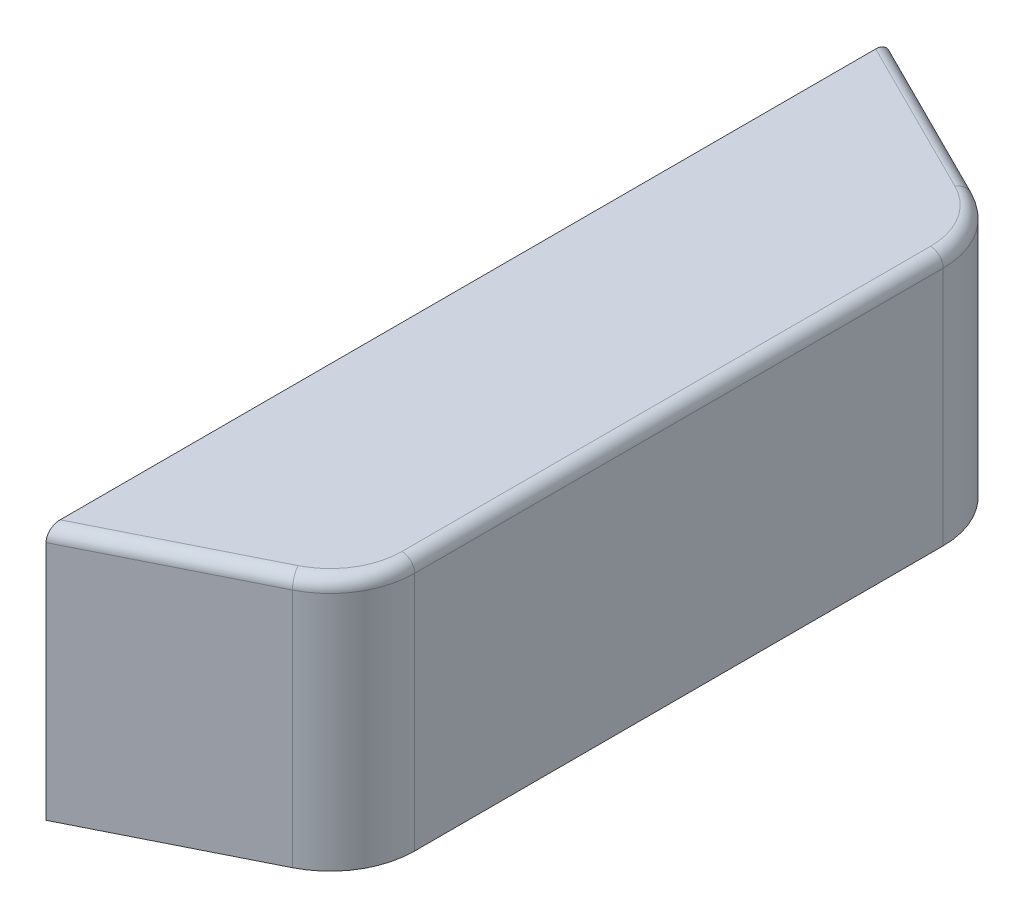
ISO-10303-21;
HEADER;
FILE_DESCRIPTION(('STEP AP214'),'2;1');
FILE_NAME('part.step','',(''),(''),'','','');
FILE_SCHEMA(('AUTOMOTIVE_DESIGN { 1 0 10303 214 1 1 1 1 }'));
ENDSEC;
DATA;
#1=APPLICATION_CONTEXT('core data for automotive mechanical design processes');
#2=APPLICATION_PROTOCOL_DEFINITION('international standard','automotive_design',2000,#1);
#3=PRODUCT_CONTEXT('',#1,'mechanical');
#4=PRODUCT('Part','Part','',(#3));
#5=PRODUCT_RELATED_PRODUCT_CATEGORY('part','',(#4));
#6=PRODUCT_DEFINITION_FORMATION('','',#4);
#7=PRODUCT_DEFINITION_CONTEXT('part definition',#1,'design');
#8=PRODUCT_DEFINITION('design','',#6,#7);
#9=PRODUCT_DEFINITION_SHAPE('','',#8);
#10=(LENGTH_UNIT() NAMED_UNIT(*) SI_UNIT(.MILLI.,.METRE.));
#11=(NAMED_UNIT(*) PLANE_ANGLE_UNIT() SI_UNIT($,.RADIAN.));
#12=(NAMED_UNIT(*) SI_UNIT($,.STERADIAN.) SOLID_ANGLE_UNIT());
#13=UNCERTAINTY_MEASURE_WITH_UNIT(LENGTH_MEASURE(1.E-05),#10,'distance_accuracy_value','');
#14=(GEOMETRIC_REPRESENTATION_CONTEXT(3) GLOBAL_UNCERTAINTY_ASSIGNED_CONTEXT((#13)) GLOBAL_UNIT_ASSIGNED_CONTEXT((#10,
#11,#12)) REPRESENTATION_CONTEXT('',''));
#15=CARTESIAN_POINT('',(0.,0.,0.));
#16=DIRECTION('',(0.,0.,1.));
#17=DIRECTION('',(1.,0.,0.));
#18=AXIS2_PLACEMENT_3D('',#15,#16,#17);
#19=CARTESIAN_POINT('',(15.,0.,-31.3196601125011));
#20=DIRECTION('',(0.,-1.,0.));
#21=DIRECTION('',(0.,0.,-1.));
#22=AXIS2_PLACEMENT_3D('',#19,#20,#21);
#23=PLANE('',#22);
#24=DIRECTION('',(-0.894427190999916,0.,-0.447213595499958));
#25=VECTOR('',#24,1.);
#26=CARTESIAN_POINT('',(0.,0.,-50.));
#27=LINE('',#26,#25);
#28=CARTESIAN_POINT('',(19.4721359549995,0.,-40.2639320225002));
#29=VERTEX_POINT('',#28);
#30=CARTESIAN_POINT('',(0.,0.,-50.));
#31=VERTEX_POINT('',#30);
#32=EDGE_CURVE('E219',#29,#31,#27,.T.);
#33=ORIENTED_EDGE('',*,*,#32,.F.);
#34=CARTESIAN_POINT('',(15.,0.,-31.3196601125011));
#35=DIRECTION('',(0.,1.,0.));
#36=DIRECTION('',(0.,0.,-1.));
#37=AXIS2_PLACEMENT_3D('',#34,#35,#36);
#38=CIRCLE('',#37,10.);
#39=CARTESIAN_POINT('',(25.,0.,-31.319660112501));
#40=VERTEX_POINT('',#39);
#41=EDGE_CURVE('E218',#40,#29,#38,.T.);
#42=ORIENTED_EDGE('',*,*,#41,.F.);
#43=DIRECTION('',(0.,0.,-1.));
#44=VECTOR('',#43,1.);
#45=CARTESIAN_POINT('',(25.,0.,31.319660112501));
#46=LINE('',#45,#44);
#47=CARTESIAN_POINT('',(25.,0.,31.319660112501));
#48=VERTEX_POINT('',#47);
#49=EDGE_CURVE('E232',#48,#40,#46,.T.);
#50=ORIENTED_EDGE('',*,*,#49,.F.);
#51=CARTESIAN_POINT('',(15.,0.,31.3196601125011));
#52=DIRECTION('',(0.,1.,0.));
#53=DIRECTION('',(0.,0.,1.));
#54=AXIS2_PLACEMENT_3D('',#51,#52,#53);
#55=CIRCLE('',#54,10.);
#56=CARTESIAN_POINT('',(19.4721359549995,0.,40.2639320225002));
#57=VERTEX_POINT('',#56);
#58=EDGE_CURVE('E229',#57,#48,#55,.T.);
#59=ORIENTED_EDGE('',*,*,#58,.F.);
#60=DIRECTION('',(0.894427190999916,0.,-0.447213595499958));
#61=VECTOR('',#60,1.);
#62=CARTESIAN_POINT('',(19.4721359549995,0.,40.2639320225002));
#63=LINE('',#62,#61);
#64=CARTESIAN_POINT('',(0.,0.,50.));
#65=VERTEX_POINT('',#64);
#66=EDGE_CURVE('E226',#65,#57,#63,.T.);
#67=ORIENTED_EDGE('',*,*,#66,.F.);
#68=DIRECTION('',(0.,0.,1.));
#69=VECTOR('',#68,1.);
#70=CARTESIAN_POINT('',(0.,0.,50.));
#71=LINE('',#70,#69);
#72=EDGE_CURVE('E222',#31,#65,#71,.T.);
#73=ORIENTED_EDGE('',*,*,#72,.F.);
#74=EDGE_LOOP('',(#33,#42,#50,#59,#67,#73));
#75=FACE_BOUND('',#74,.T.);
#76=CARTESIAN_POINT('',(15.,0.,-31.3196601125011));
#77=DIRECTION('',(0.,-1.,0.));
#78=DIRECTION('',(0.,0.,-1.));
#79=AXIS2_PLACEMENT_3D('',#76,#77,#78);
#80=CIRCLE('',#79,8.5);
#81=CARTESIAN_POINT('',(23.5,0.,-31.319660112501));
#82=VERTEX_POINT('',#81);
#83=CARTESIAN_POINT('',(18.8013155617496,0.,-38.9222912360004));
#84=VERTEX_POINT('',#83);
#85=EDGE_CURVE('E182',#82,#84,#80,.F.);
#86=ORIENTED_EDGE('',*,*,#85,.T.);
#87=DIRECTION('',(-0.894427190999916,0.,-0.447213595499958));
#88=VECTOR('',#87,1.);
#89=CARTESIAN_POINT('',(18.8013155617496,0.,-38.9222912360003));
#90=LINE('',#89,#88);
#91=CARTESIAN_POINT('',(4.39442719099991,0.,-46.1257354213752));
#92=VERTEX_POINT('',#91);
#93=EDGE_CURVE('E191',#84,#92,#90,.T.);
#94=ORIENTED_EDGE('',*,*,#93,.T.);
#95=CARTESIAN_POINT('',(3.5,0.,-44.3368810393754));
#96=DIRECTION('',(0.,-1.,0.));
#97=DIRECTION('',(0.,0.,-1.));
#98=AXIS2_PLACEMENT_3D('',#95,#96,#97);
#99=CIRCLE('',#98,2.);
#100=CARTESIAN_POINT('',(1.5,0.,-44.3368810393754));
#101=VERTEX_POINT('',#100);
#102=EDGE_CURVE('E280',#92,#101,#99,.F.);
#103=ORIENTED_EDGE('',*,*,#102,.T.);
#104=DIRECTION('',(0.,0.,1.));
#105=VECTOR('',#104,1.);
#106=CARTESIAN_POINT('',(1.5,0.,-31.3196601125011));
#107=LINE('',#106,#105);
#108=CARTESIAN_POINT('',(1.5,0.,44.3368810393754));
#109=VERTEX_POINT('',#108);
#110=EDGE_CURVE('E197',#101,#109,#107,.T.);
#111=ORIENTED_EDGE('',*,*,#110,.T.);
#112=CARTESIAN_POINT('',(3.5,0.,44.3368810393754));
#113=DIRECTION('',(0.,-1.,0.));
#114=DIRECTION('',(0.,0.,-1.));
#115=AXIS2_PLACEMENT_3D('',#112,#113,#114);
#116=CIRCLE('',#115,2.);
#117=CARTESIAN_POINT('',(4.3944271909999,0.,46.1257354213752));
#118=VERTEX_POINT('',#117);
#119=EDGE_CURVE('E282',#109,#118,#116,.F.);
#120=ORIENTED_EDGE('',*,*,#119,.T.);
#121=DIRECTION('',(0.894427190999916,0.,-0.447213595499958));
#122=VECTOR('',#121,1.);
#123=CARTESIAN_POINT('',(43.8570436517505,0.,26.3944271909999));
#124=LINE('',#123,#122);
#125=CARTESIAN_POINT('',(18.8013155617496,0.,38.9222912360004));
#126=VERTEX_POINT('',#125);
#127=EDGE_CURVE('E209',#118,#126,#124,.T.);
#128=ORIENTED_EDGE('',*,*,#127,.T.);
#129=CARTESIAN_POINT('',(15.,0.,31.3196601125011));
#130=DIRECTION('',(0.,-1.,0.));
#131=DIRECTION('',(0.,0.,-1.));
#132=AXIS2_PLACEMENT_3D('',#129,#130,#131);
#133=CIRCLE('',#132,8.5);
#134=CARTESIAN_POINT('',(23.5,0.,31.319660112501));
#135=VERTEX_POINT('',#134);
#136=EDGE_CURVE('E204',#126,#135,#133,.F.);
#137=ORIENTED_EDGE('',*,*,#136,.T.);
#138=DIRECTION('',(0.,0.,-1.));
#139=VECTOR('',#138,1.);
#140=CARTESIAN_POINT('',(23.5,0.,-31.3196601125011));
#141=LINE('',#140,#139);
#142=EDGE_CURVE('E202',#135,#82,#141,.T.);
#143=ORIENTED_EDGE('',*,*,#142,.T.);
#144=EDGE_LOOP('',(#86,#94,#103,#111,#120,#128,#137,#143));
#145=FACE_BOUND('',#144,.T.);
#146=ADVANCED_FACE('F39',(#75,#145),#23,.T.);
#147=CARTESIAN_POINT('',(0.,30.,-50.));
#148=DIRECTION('',(-0.447213595499958,0.,0.894427190999916));
#149=DIRECTION('',(0.894427190999916,0.,0.447213595499958));
#150=AXIS2_PLACEMENT_3D('',#147,#148,#149);
#151=PLANE('',#150);
#152=DIRECTION('',(0.,-1.,0.));
#153=VECTOR('',#152,1.);
#154=CARTESIAN_POINT('',(0.,30.,-50.));
#155=LINE('',#154,#153);
#156=CARTESIAN_POINT('',(0.,28.5,-50.));
#157=VERTEX_POINT('',#156);
#158=EDGE_CURVE('E246',#157,#31,#155,.T.);
#159=ORIENTED_EDGE('',*,*,#158,.F.);
#160=DIRECTION('',(-0.894427190999916,0.,-0.447213595499958));
#161=VECTOR('',#160,1.);
#162=CARTESIAN_POINT('',(0.,28.5,-50.));
#163=LINE('',#162,#161);
#164=CARTESIAN_POINT('',(19.4721359549995,28.5,-40.2639320225002));
#165=VERTEX_POINT('',#164);
#166=EDGE_CURVE('E63',#157,#165,#163,.F.);
#167=ORIENTED_EDGE('',*,*,#166,.T.);
#168=DIRECTION('',(0.,-1.,0.));
#169=VECTOR('',#168,1.);
#170=CARTESIAN_POINT('',(19.4721359549995,30.,-40.2639320225002));
#171=LINE('',#170,#169);
#172=EDGE_CURVE('E217',#165,#29,#171,.T.);
#173=ORIENTED_EDGE('',*,*,#172,.T.);
#174=ORIENTED_EDGE('',*,*,#32,.T.);
#175=EDGE_LOOP('',(#159,#167,#173,#174));
#176=FACE_BOUND('',#175,.T.);
#177=ADVANCED_FACE('F384',(#176),#151,.F.);
#178=CARTESIAN_POINT('',(0.,30.,50.));
#179=DIRECTION('',(1.,0.,0.));
#180=DIRECTION('',(0.,0.,-1.));
#181=AXIS2_PLACEMENT_3D('',#178,#179,#180);
#182=PLANE('',#181);
#183=DIRECTION('',(0.,-1.,0.));
#184=VECTOR('',#183,1.);
#185=CARTESIAN_POINT('',(0.,30.,50.));
#186=LINE('',#185,#184);
#187=CARTESIAN_POINT('',(0.,28.5,50.));
#188=VERTEX_POINT('',#187);
#189=EDGE_CURVE('E244',#188,#65,#186,.T.);
#190=ORIENTED_EDGE('',*,*,#189,.F.);
#191=CARTESIAN_POINT('',(0.,28.5,48.3229490168752));
#192=DIRECTION('',(1.,0.,0.));
#193=DIRECTION('',(0.,0.,-1.));
#194=AXIS2_PLACEMENT_3D('',#191,#192,#193);
#195=ELLIPSE('',#194,1.67705098312484,1.5);
#196=CARTESIAN_POINT('',(0.,30.,48.3229490168752));
#197=VERTEX_POINT('',#196);
#198=EDGE_CURVE('E326',#188,#197,#195,.F.);
#199=ORIENTED_EDGE('',*,*,#198,.T.);
#200=DIRECTION('',(0.,0.,1.));
#201=VECTOR('',#200,1.);
#202=CARTESIAN_POINT('',(0.,30.,50.));
#203=LINE('',#202,#201);
#204=CARTESIAN_POINT('',(0.,30.,-48.3229490168752));
#205=VERTEX_POINT('',#204);
#206=EDGE_CURVE('E214',#205,#197,#203,.T.);
#207=ORIENTED_EDGE('',*,*,#206,.F.);
#208=CARTESIAN_POINT('',(0.,28.5,-48.3229490168752));
#209=DIRECTION('',(1.,0.,0.));
#210=DIRECTION('',(0.,0.,-1.));
#211=AXIS2_PLACEMENT_3D('',#208,#209,#210);
#212=ELLIPSE('',#211,1.67705098312484,1.5);
#213=EDGE_CURVE('E324',#205,#157,#212,.F.);
#214=ORIENTED_EDGE('',*,*,#213,.T.);
#215=ORIENTED_EDGE('',*,*,#158,.T.);
#216=ORIENTED_EDGE('',*,*,#72,.T.);
#217=EDGE_LOOP('',(#190,#199,#207,#214,#215,#216));
#218=FACE_BOUND('',#217,.T.);
#219=ADVANCED_FACE('F356',(#218),#182,.F.);
#220=CARTESIAN_POINT('',(19.4721359549995,30.,40.2639320225002));
#221=DIRECTION('',(-0.447213595499958,0.,-0.894427190999916));
#222=DIRECTION('',(-0.894427190999916,0.,0.447213595499958));
#223=AXIS2_PLACEMENT_3D('',#220,#221,#222);
#224=PLANE('',#223);
#225=DIRECTION('',(0.,-1.,0.));
#226=VECTOR('',#225,1.);
#227=CARTESIAN_POINT('',(19.4721359549995,30.,40.2639320225002));
#228=LINE('',#227,#226);
#229=CARTESIAN_POINT('',(19.4721359549995,28.5,40.2639320225002));
#230=VERTEX_POINT('',#229);
#231=EDGE_CURVE('E242',#230,#57,#228,.T.);
#232=ORIENTED_EDGE('',*,*,#231,.F.);
#233=DIRECTION('',(0.894427190999916,0.,-0.447213595499958));
#234=VECTOR('',#233,1.);
#235=CARTESIAN_POINT('',(19.4721359549995,28.5,40.2639320225002));
#236=LINE('',#235,#234);
#237=EDGE_CURVE('E322',#230,#188,#236,.F.);
#238=ORIENTED_EDGE('',*,*,#237,.T.);
#239=ORIENTED_EDGE('',*,*,#189,.T.);
#240=ORIENTED_EDGE('',*,*,#66,.T.);
#241=EDGE_LOOP('',(#232,#238,#239,#240));
#242=FACE_BOUND('',#241,.T.);
#243=ADVANCED_FACE('F373',(#242),#224,.F.);
#244=CARTESIAN_POINT('',(15.,30.,31.3196601125011));
#245=DIRECTION('',(0.,-1.,0.));
#246=DIRECTION('',(0.,0.,-1.));
#247=AXIS2_PLACEMENT_3D('',#244,#245,#246);
#248=CYLINDRICAL_SURFACE('',#247,10.);
#249=DIRECTION('',(0.,-1.,0.));
#250=VECTOR('',#249,1.);
#251=CARTESIAN_POINT('',(25.,30.,31.319660112501));
#252=LINE('',#251,#250);
#253=CARTESIAN_POINT('',(25.,28.5,31.319660112501));
#254=VERTEX_POINT('',#253);
#255=EDGE_CURVE('E240',#254,#48,#252,.T.);
#256=ORIENTED_EDGE('',*,*,#255,.F.);
#257=CARTESIAN_POINT('',(15.,28.5,31.3196601125011));
#258=DIRECTION('',(0.,-1.,0.));
#259=DIRECTION('',(0.,0.,-1.));
#260=AXIS2_PLACEMENT_3D('',#257,#258,#259);
#261=CIRCLE('',#260,10.);
#262=EDGE_CURVE('E328',#254,#230,#261,.T.);
#263=ORIENTED_EDGE('',*,*,#262,.T.);
#264=ORIENTED_EDGE('',*,*,#231,.T.);
#265=ORIENTED_EDGE('',*,*,#58,.T.);
#266=EDGE_LOOP('',(#256,#263,#264,#265));
#267=FACE_BOUND('',#266,.T.);
#268=ADVANCED_FACE('F371',(#267),#248,.T.);
#269=CARTESIAN_POINT('',(25.,30.,31.319660112501));
#270=DIRECTION('',(-1.,0.,0.));
#271=DIRECTION('',(0.,0.,1.));
#272=AXIS2_PLACEMENT_3D('',#269,#270,#271);
#273=PLANE('',#272);
#274=DIRECTION('',(0.,-1.,0.));
#275=VECTOR('',#274,1.);
#276=CARTESIAN_POINT('',(25.,30.,-31.319660112501));
#277=LINE('',#276,#275);
#278=CARTESIAN_POINT('',(25.,28.5,-31.319660112501));
#279=VERTEX_POINT('',#278);
#280=EDGE_CURVE('E238',#279,#40,#277,.T.);
#281=ORIENTED_EDGE('',*,*,#280,.F.);
#282=DIRECTION('',(0.,0.,-1.));
#283=VECTOR('',#282,1.);
#284=CARTESIAN_POINT('',(25.,28.5,31.319660112501));
#285=LINE('',#284,#283);
#286=EDGE_CURVE('E11',#279,#254,#285,.F.);
#287=ORIENTED_EDGE('',*,*,#286,.T.);
#288=ORIENTED_EDGE('',*,*,#255,.T.);
#289=ORIENTED_EDGE('',*,*,#49,.T.);
#290=EDGE_LOOP('',(#281,#287,#288,#289));
#291=FACE_BOUND('',#290,.T.);
#292=ADVANCED_FACE('F382',(#291),#273,.F.);
#293=CARTESIAN_POINT('',(15.,30.,-31.3196601125011));
#294=DIRECTION('',(0.,-1.,0.));
#295=DIRECTION('',(0.,0.,-1.));
#296=AXIS2_PLACEMENT_3D('',#293,#294,#295);
#297=CYLINDRICAL_SURFACE('',#296,10.);
#298=ORIENTED_EDGE('',*,*,#172,.F.);
#299=CARTESIAN_POINT('',(15.,28.5,-31.3196601125011));
#300=DIRECTION('',(0.,-1.,0.));
#301=DIRECTION('',(0.,0.,-1.));
#302=AXIS2_PLACEMENT_3D('',#299,#300,#301);
#303=CIRCLE('',#302,10.);
#304=EDGE_CURVE('E48',#165,#279,#303,.T.);
#305=ORIENTED_EDGE('',*,*,#304,.T.);
#306=ORIENTED_EDGE('',*,*,#280,.T.);
#307=ORIENTED_EDGE('',*,*,#41,.T.);
#308=EDGE_LOOP('',(#298,#305,#306,#307));
#309=FACE_BOUND('',#308,.T.);
#310=ADVANCED_FACE('F383',(#309),#297,.T.);
#311=CARTESIAN_POINT('',(15.,30.,-31.3196601125011));
#312=DIRECTION('',(0.,-1.,0.));
#313=DIRECTION('',(0.,0.,-1.));
#314=AXIS2_PLACEMENT_3D('',#311,#312,#313);
#315=PLANE('',#314);
#316=ORIENTED_EDGE('',*,*,#206,.T.);
#317=DIRECTION('',(0.894427190999916,0.,-0.447213595499958));
#318=VECTOR('',#317,1.);
#319=CARTESIAN_POINT('',(43.8570436517505,30.,26.3944271909999));
#320=LINE('',#319,#318);
#321=CARTESIAN_POINT('',(18.8013155617496,30.,38.9222912360004));
#322=VERTEX_POINT('',#321);
#323=EDGE_CURVE('E319',#197,#322,#320,.T.);
#324=ORIENTED_EDGE('',*,*,#323,.T.);
#325=CARTESIAN_POINT('',(15.,30.,31.3196601125011));
#326=DIRECTION('',(0.,-1.,0.));
#327=DIRECTION('',(0.,0.,-1.));
#328=AXIS2_PLACEMENT_3D('',#325,#326,#327);
#329=CIRCLE('',#328,8.5);
#330=CARTESIAN_POINT('',(23.5,30.,31.319660112501));
#331=VERTEX_POINT('',#330);
#332=EDGE_CURVE('E317',#322,#331,#329,.F.);
#333=ORIENTED_EDGE('',*,*,#332,.T.);
#334=DIRECTION('',(0.,0.,-1.));
#335=VECTOR('',#334,1.);
#336=CARTESIAN_POINT('',(23.5,30.,-31.3196601125011));
#337=LINE('',#336,#335);
#338=CARTESIAN_POINT('',(23.5,30.,-31.319660112501));
#339=VERTEX_POINT('',#338);
#340=EDGE_CURVE('E284',#331,#339,#337,.T.);
#341=ORIENTED_EDGE('',*,*,#340,.T.);
#342=CARTESIAN_POINT('',(15.,30.,-31.3196601125011));
#343=DIRECTION('',(0.,-1.,0.));
#344=DIRECTION('',(0.,0.,-1.));
#345=AXIS2_PLACEMENT_3D('',#342,#343,#344);
#346=CIRCLE('',#345,8.5);
#347=CARTESIAN_POINT('',(18.8013155617496,30.,-38.9222912360004));
#348=VERTEX_POINT('',#347);
#349=EDGE_CURVE('E313',#339,#348,#346,.F.);
#350=ORIENTED_EDGE('',*,*,#349,.T.);
#351=DIRECTION('',(-0.894427190999916,0.,-0.447213595499958));
#352=VECTOR('',#351,1.);
#353=CARTESIAN_POINT('',(18.8013155617496,30.,-38.9222912360003));
#354=LINE('',#353,#352);
#355=EDGE_CURVE('E315',#348,#205,#354,.T.);
#356=ORIENTED_EDGE('',*,*,#355,.T.);
#357=EDGE_LOOP('',(#316,#324,#333,#341,#350,#356));
#358=FACE_BOUND('',#357,.T.);
#359=ADVANCED_FACE('F352',(#358),#315,.F.);
#360=CARTESIAN_POINT('',(-0.670820393249937,30.,-48.6583592135001));
#361=DIRECTION('',(-0.447213595499958,0.,0.894427190999916));
#362=DIRECTION('',(0.894427190999916,0.,0.447213595499958));
#363=AXIS2_PLACEMENT_3D('',#360,#361,#362);
#364=PLANE('',#363);
#365=DIRECTION('',(0.,1.,0.));
#366=VECTOR('',#365,1.);
#367=CARTESIAN_POINT('',(18.8013155617496,30.,-38.9222912360004));
#368=LINE('',#367,#366);
#369=CARTESIAN_POINT('',(18.8013155617496,26.5,-38.9222912360004));
#370=VERTEX_POINT('',#369);
#371=EDGE_CURVE('E177',#370,#84,#368,.F.);
#372=ORIENTED_EDGE('',*,*,#371,.F.);
#373=DIRECTION('',(-0.894427190999916,0.,-0.447213595499958));
#374=VECTOR('',#373,1.);
#375=CARTESIAN_POINT('',(1.5,26.5,-47.5729490168752));
#376=LINE('',#375,#374);
#377=CARTESIAN_POINT('',(4.39442719099992,26.5,-46.1257354213752));
#378=VERTEX_POINT('',#377);
#379=EDGE_CURVE('E278',#370,#378,#376,.T.);
#380=ORIENTED_EDGE('',*,*,#379,.T.);
#381=DIRECTION('',(0.,-1.,0.));
#382=VECTOR('',#381,1.);
#383=CARTESIAN_POINT('',(4.39442719099992,0.,-46.1257354213752));
#384=LINE('',#383,#382);
#385=EDGE_CURVE('E194',#378,#92,#384,.T.);
#386=ORIENTED_EDGE('',*,*,#385,.T.);
#387=ORIENTED_EDGE('',*,*,#93,.F.);
#388=EDGE_LOOP('',(#372,#380,#386,#387));
#389=FACE_BOUND('',#388,.T.);
#390=ADVANCED_FACE('F192',(#389),#364,.T.);
#391=CARTESIAN_POINT('',(1.5,30.,50.));
#392=DIRECTION('',(1.,0.,0.));
#393=DIRECTION('',(0.,0.,-1.));
#394=AXIS2_PLACEMENT_3D('',#391,#392,#393);
#395=PLANE('',#394);
#396=ORIENTED_EDGE('',*,*,#110,.F.);
#397=DIRECTION('',(0.,-1.,0.));
#398=VECTOR('',#397,1.);
#399=CARTESIAN_POINT('',(1.5,28.5,-44.3368810393754));
#400=LINE('',#399,#398);
#401=CARTESIAN_POINT('',(1.5,26.5,-44.3368810393754));
#402=VERTEX_POINT('',#401);
#403=EDGE_CURVE('E253',#101,#402,#400,.F.);
#404=ORIENTED_EDGE('',*,*,#403,.T.);
#405=DIRECTION('',(0.,0.,1.));
#406=VECTOR('',#405,1.);
#407=CARTESIAN_POINT('',(1.5,26.5,47.5729490168752));
#408=LINE('',#407,#406);
#409=CARTESIAN_POINT('',(1.5,26.5,44.3368810393754));
#410=VERTEX_POINT('',#409);
#411=EDGE_CURVE('E250',#402,#410,#408,.T.);
#412=ORIENTED_EDGE('',*,*,#411,.T.);
#413=DIRECTION('',(0.,-1.,0.));
#414=VECTOR('',#413,1.);
#415=CARTESIAN_POINT('',(1.5,0.,44.3368810393754));
#416=LINE('',#415,#414);
#417=EDGE_CURVE('E248',#410,#109,#416,.T.);
#418=ORIENTED_EDGE('',*,*,#417,.T.);
#419=EDGE_LOOP('',(#396,#404,#412,#418));
#420=FACE_BOUND('',#419,.T.);
#421=ADVANCED_FACE('F524',(#420),#395,.T.);
#422=CARTESIAN_POINT('',(18.8013155617496,30.,38.9222912360004));
#423=DIRECTION('',(-0.447213595499958,0.,-0.894427190999916));
#424=DIRECTION('',(-0.894427190999916,0.,0.447213595499958));
#425=AXIS2_PLACEMENT_3D('',#422,#423,#424);
#426=PLANE('',#425);
#427=DIRECTION('',(0.,-1.,0.));
#428=VECTOR('',#427,1.);
#429=CARTESIAN_POINT('',(4.39442719099992,28.5,46.1257354213752));
#430=LINE('',#429,#428);
#431=CARTESIAN_POINT('',(4.39442719099992,26.5,46.1257354213752));
#432=VERTEX_POINT('',#431);
#433=EDGE_CURVE('E268',#118,#432,#430,.F.);
#434=ORIENTED_EDGE('',*,*,#433,.T.);
#435=DIRECTION('',(0.894427190999916,0.,-0.447213595499958));
#436=VECTOR('',#435,1.);
#437=CARTESIAN_POINT('',(18.8013155617496,26.5,38.9222912360004));
#438=LINE('',#437,#436);
#439=CARTESIAN_POINT('',(18.8013155617496,26.5,38.9222912360004));
#440=VERTEX_POINT('',#439);
#441=EDGE_CURVE('E270',#432,#440,#438,.T.);
#442=ORIENTED_EDGE('',*,*,#441,.T.);
#443=DIRECTION('',(0.,-1.,0.));
#444=VECTOR('',#443,1.);
#445=CARTESIAN_POINT('',(18.8013155617496,30.,38.9222912360004));
#446=LINE('',#445,#444);
#447=EDGE_CURVE('E223',#440,#126,#446,.T.);
#448=ORIENTED_EDGE('',*,*,#447,.T.);
#449=ORIENTED_EDGE('',*,*,#127,.F.);
#450=EDGE_LOOP('',(#434,#442,#448,#449));
#451=FACE_BOUND('',#450,.T.);
#452=ADVANCED_FACE('F516',(#451),#426,.T.);
#453=CARTESIAN_POINT('',(15.,30.,31.3196601125011));
#454=DIRECTION('',(0.,-1.,0.));
#455=DIRECTION('',(0.,0.,-1.));
#456=AXIS2_PLACEMENT_3D('',#453,#454,#455);
#457=CYLINDRICAL_SURFACE('',#456,8.5);
#458=ORIENTED_EDGE('',*,*,#447,.F.);
#459=CARTESIAN_POINT('',(15.,26.5,31.3196601125011));
#460=DIRECTION('',(0.,-1.,0.));
#461=DIRECTION('',(0.,0.,-1.));
#462=AXIS2_PLACEMENT_3D('',#459,#460,#461);
#463=CIRCLE('',#462,8.5);
#464=CARTESIAN_POINT('',(23.5,26.5,31.319660112501));
#465=VERTEX_POINT('',#464);
#466=EDGE_CURVE('E272',#440,#465,#463,.F.);
#467=ORIENTED_EDGE('',*,*,#466,.T.);
#468=DIRECTION('',(0.,1.,0.));
#469=VECTOR('',#468,1.);
#470=CARTESIAN_POINT('',(23.5,30.,31.319660112501));
#471=LINE('',#470,#469);
#472=EDGE_CURVE('E732',#465,#135,#471,.F.);
#473=ORIENTED_EDGE('',*,*,#472,.T.);
#474=ORIENTED_EDGE('',*,*,#136,.F.);
#475=EDGE_LOOP('',(#458,#467,#473,#474));
#476=FACE_BOUND('',#475,.T.);
#477=ADVANCED_FACE('F508',(#476),#457,.F.);
#478=CARTESIAN_POINT('',(23.5,30.,31.319660112501));
#479=DIRECTION('',(-1.,0.,0.));
#480=DIRECTION('',(0.,0.,1.));
#481=AXIS2_PLACEMENT_3D('',#478,#479,#480);
#482=PLANE('',#481);
#483=ORIENTED_EDGE('',*,*,#472,.F.);
#484=DIRECTION('',(0.,0.,-1.));
#485=VECTOR('',#484,1.);
#486=CARTESIAN_POINT('',(23.5,26.5,-31.319660112501));
#487=LINE('',#486,#485);
#488=CARTESIAN_POINT('',(23.5,26.5,-31.319660112501));
#489=VERTEX_POINT('',#488);
#490=EDGE_CURVE('E274',#465,#489,#487,.T.);
#491=ORIENTED_EDGE('',*,*,#490,.T.);
#492=DIRECTION('',(0.,-1.,0.));
#493=VECTOR('',#492,1.);
#494=CARTESIAN_POINT('',(23.5,30.,-31.319660112501));
#495=LINE('',#494,#493);
#496=EDGE_CURVE('E188',#489,#82,#495,.T.);
#497=ORIENTED_EDGE('',*,*,#496,.T.);
#498=ORIENTED_EDGE('',*,*,#142,.F.);
#499=EDGE_LOOP('',(#483,#491,#497,#498));
#500=FACE_BOUND('',#499,.T.);
#501=ADVANCED_FACE('F501',(#500),#482,.T.);
#502=CARTESIAN_POINT('',(15.,30.,-31.3196601125011));
#503=DIRECTION('',(0.,-1.,0.));
#504=DIRECTION('',(0.,0.,-1.));
#505=AXIS2_PLACEMENT_3D('',#502,#503,#504);
#506=CYLINDRICAL_SURFACE('',#505,8.5);
#507=ORIENTED_EDGE('',*,*,#496,.F.);
#508=CARTESIAN_POINT('',(15.,26.5,-31.3196601125011));
#509=DIRECTION('',(0.,-1.,0.));
#510=DIRECTION('',(0.,0.,-1.));
#511=AXIS2_PLACEMENT_3D('',#508,#509,#510);
#512=CIRCLE('',#511,8.5);
#513=EDGE_CURVE('E185',#489,#370,#512,.F.);
#514=ORIENTED_EDGE('',*,*,#513,.T.);
#515=ORIENTED_EDGE('',*,*,#371,.T.);
#516=ORIENTED_EDGE('',*,*,#85,.F.);
#517=EDGE_LOOP('',(#507,#514,#515,#516));
#518=FACE_BOUND('',#517,.T.);
#519=ADVANCED_FACE('F180',(#518),#506,.F.);
#520=CARTESIAN_POINT('',(15.,28.5,-31.3196601125011));
#521=DIRECTION('',(0.,-1.,0.));
#522=DIRECTION('',(0.,0.,-1.));
#523=AXIS2_PLACEMENT_3D('',#520,#521,#522);
#524=PLANE('',#523);
#525=DIRECTION('',(0.894427190999916,0.,-0.447213595499958));
#526=VECTOR('',#525,1.);
#527=CARTESIAN_POINT('',(0.605572809000077,28.5,45.7840946348753));
#528=LINE('',#527,#526);
#529=CARTESIAN_POINT('',(17.9068883707497,28.5,37.1334368540005));
#530=VERTEX_POINT('',#529);
#531=CARTESIAN_POINT('',(3.5,28.5,44.3368810393754));
#532=VERTEX_POINT('',#531);
#533=EDGE_CURVE('E263',#530,#532,#528,.F.);
#534=ORIENTED_EDGE('',*,*,#533,.T.);
#535=DIRECTION('',(0.,0.,1.));
#536=VECTOR('',#535,1.);
#537=CARTESIAN_POINT('',(3.5,28.5,-47.5729490168752));
#538=LINE('',#537,#536);
#539=CARTESIAN_POINT('',(3.5,28.5,-44.3368810393754));
#540=VERTEX_POINT('',#539);
#541=EDGE_CURVE('E265',#532,#540,#538,.F.);
#542=ORIENTED_EDGE('',*,*,#541,.T.);
#543=DIRECTION('',(-0.894427190999916,0.,-0.447213595499958));
#544=VECTOR('',#543,1.);
#545=CARTESIAN_POINT('',(17.9068883707497,28.5,-37.1334368540005));
#546=LINE('',#545,#544);
#547=CARTESIAN_POINT('',(17.9068883707497,28.5,-37.1334368540005));
#548=VERTEX_POINT('',#547);
#549=EDGE_CURVE('E255',#540,#548,#546,.F.);
#550=ORIENTED_EDGE('',*,*,#549,.T.);
#551=CARTESIAN_POINT('',(15.,28.5,-31.3196601125011));
#552=DIRECTION('',(0.,-1.,0.));
#553=DIRECTION('',(0.,0.,-1.));
#554=AXIS2_PLACEMENT_3D('',#551,#552,#553);
#555=CIRCLE('',#554,6.5);
#556=CARTESIAN_POINT('',(21.5,28.5,-31.319660112501));
#557=VERTEX_POINT('',#556);
#558=EDGE_CURVE('E257',#548,#557,#555,.T.);
#559=ORIENTED_EDGE('',*,*,#558,.T.);
#560=DIRECTION('',(0.,0.,-1.));
#561=VECTOR('',#560,1.);
#562=CARTESIAN_POINT('',(21.5,28.5,31.319660112501));
#563=LINE('',#562,#561);
#564=CARTESIAN_POINT('',(21.5,28.5,31.319660112501));
#565=VERTEX_POINT('',#564);
#566=EDGE_CURVE('E259',#557,#565,#563,.F.);
#567=ORIENTED_EDGE('',*,*,#566,.T.);
#568=CARTESIAN_POINT('',(15.,28.5,31.3196601125011));
#569=DIRECTION('',(0.,-1.,0.));
#570=DIRECTION('',(0.,0.,-1.));
#571=AXIS2_PLACEMENT_3D('',#568,#569,#570);
#572=CIRCLE('',#571,6.5);
#573=EDGE_CURVE('E261',#565,#530,#572,.T.);
#574=ORIENTED_EDGE('',*,*,#573,.T.);
#575=EDGE_LOOP('',(#534,#542,#550,#559,#567,#574));
#576=FACE_BOUND('',#575,.T.);
#577=ADVANCED_FACE('F434',(#576),#524,.T.);
#578=CARTESIAN_POINT('',(21.5,26.5,31.319660112501));
#579=DIRECTION('',(0.,0.,1.));
#580=DIRECTION('',(1.,0.,0.));
#581=AXIS2_PLACEMENT_3D('',#578,#579,#580);
#582=CYLINDRICAL_SURFACE('',#581,2.);
#583=CARTESIAN_POINT('',(21.5,26.5,31.319660112501));
#584=DIRECTION('',(0.,0.,-1.));
#585=DIRECTION('',(-1.,0.,0.));
#586=AXIS2_PLACEMENT_3D('',#583,#584,#585);
#587=CIRCLE('',#586,2.);
#588=EDGE_CURVE('E307',#565,#465,#587,.T.);
#589=ORIENTED_EDGE('',*,*,#588,.F.);
#590=ORIENTED_EDGE('',*,*,#566,.F.);
#591=CARTESIAN_POINT('',(21.5,26.5,-31.319660112501));
#592=DIRECTION('',(0.,0.,1.));
#593=DIRECTION('',(1.,0.,0.));
#594=AXIS2_PLACEMENT_3D('',#591,#592,#593);
#595=CIRCLE('',#594,2.);
#596=EDGE_CURVE('E198',#489,#557,#595,.T.);
#597=ORIENTED_EDGE('',*,*,#596,.F.);
#598=ORIENTED_EDGE('',*,*,#490,.F.);
#599=EDGE_LOOP('',(#589,#590,#597,#598));
#600=FACE_BOUND('',#599,.T.);
#601=ADVANCED_FACE('F430',(#600),#582,.F.);
#602=CARTESIAN_POINT('',(15.,26.5,-31.3196601125011));
#603=DIRECTION('',(0.,-1.,0.));
#604=DIRECTION('',(0.,0.,-1.));
#605=AXIS2_PLACEMENT_3D('',#602,#603,#604);
#606=TOROIDAL_SURFACE('',#605,6.5,2.);
#607=ORIENTED_EDGE('',*,*,#596,.T.);
#608=ORIENTED_EDGE('',*,*,#558,.F.);
#609=CARTESIAN_POINT('',(17.9068883707497,26.5,-37.1334368540005));
#610=DIRECTION('',(0.894427190999918,0.,0.447213595499954));
#611=DIRECTION('',(0.447213595499954,0.,-0.894427190999918));
#612=AXIS2_PLACEMENT_3D('',#609,#610,#611);
#613=CIRCLE('',#612,2.);
#614=EDGE_CURVE('E304',#370,#548,#613,.T.);
#615=ORIENTED_EDGE('',*,*,#614,.F.);
#616=ORIENTED_EDGE('',*,*,#513,.F.);
#617=EDGE_LOOP('',(#607,#608,#615,#616));
#618=FACE_BOUND('',#617,.T.);
#619=ADVANCED_FACE('F426',(#618),#606,.F.);
#620=CARTESIAN_POINT('',(15.,26.5,31.3196601125011));
#621=DIRECTION('',(0.,-1.,0.));
#622=DIRECTION('',(0.,0.,-1.));
#623=AXIS2_PLACEMENT_3D('',#620,#621,#622);
#624=TOROIDAL_SURFACE('',#623,6.5,2.);
#625=ORIENTED_EDGE('',*,*,#588,.T.);
#626=ORIENTED_EDGE('',*,*,#466,.F.);
#627=CARTESIAN_POINT('',(17.9068883707497,26.5,37.1334368540005));
#628=DIRECTION('',(0.894427190999916,0.,-0.447213595499958));
#629=DIRECTION('',(-0.447213595499958,0.,-0.894427190999916));
#630=AXIS2_PLACEMENT_3D('',#627,#628,#629);
#631=CIRCLE('',#630,2.);
#632=EDGE_CURVE('E301',#530,#440,#631,.T.);
#633=ORIENTED_EDGE('',*,*,#632,.F.);
#634=ORIENTED_EDGE('',*,*,#573,.F.);
#635=EDGE_LOOP('',(#625,#626,#633,#634));
#636=FACE_BOUND('',#635,.T.);
#637=ADVANCED_FACE('F422',(#636),#624,.F.);
#638=CARTESIAN_POINT('',(-1.56524758424985,26.5,-46.8695048315003));
#639=DIRECTION('',(0.894427190999916,0.,0.447213595499958));
#640=DIRECTION('',(0.447213595499958,0.,-0.894427190999916));
#641=AXIS2_PLACEMENT_3D('',#638,#639,#640);
#642=CYLINDRICAL_SURFACE('',#641,2.);
#643=ORIENTED_EDGE('',*,*,#614,.T.);
#644=ORIENTED_EDGE('',*,*,#549,.F.);
#645=CARTESIAN_POINT('',(3.5,26.5,-44.3368810393754));
#646=DIRECTION('',(0.894427190999916,0.,0.447213595499958));
#647=DIRECTION('',(0.447213595499958,0.,-0.894427190999916));
#648=AXIS2_PLACEMENT_3D('',#645,#646,#647);
#649=CIRCLE('',#648,2.);
#650=EDGE_CURVE('E298',#378,#540,#649,.T.);
#651=ORIENTED_EDGE('',*,*,#650,.F.);
#652=ORIENTED_EDGE('',*,*,#379,.F.);
#653=EDGE_LOOP('',(#643,#644,#651,#652));
#654=FACE_BOUND('',#653,.T.);
#655=ADVANCED_FACE('F418',(#654),#642,.F.);
#656=CARTESIAN_POINT('',(3.5,30.,-44.3368810393754));
#657=DIRECTION('',(0.,1.,0.));
#658=DIRECTION('',(0.,0.,1.));
#659=AXIS2_PLACEMENT_3D('',#656,#657,#658);
#660=CYLINDRICAL_SURFACE('',#659,2.);
#661=ORIENTED_EDGE('',*,*,#102,.F.);
#662=ORIENTED_EDGE('',*,*,#385,.F.);
#663=CARTESIAN_POINT('',(3.5,26.5,-44.3368810393754));
#664=DIRECTION('',(0.,-1.,0.));
#665=DIRECTION('',(0.,0.,-1.));
#666=AXIS2_PLACEMENT_3D('',#663,#664,#665);
#667=CIRCLE('',#666,2.);
#668=EDGE_CURVE('E295',#402,#378,#667,.T.);
#669=ORIENTED_EDGE('',*,*,#668,.F.);
#670=ORIENTED_EDGE('',*,*,#403,.F.);
#671=EDGE_LOOP('',(#661,#662,#669,#670));
#672=FACE_BOUND('',#671,.T.);
#673=ADVANCED_FACE('F414',(#672),#660,.F.);
#674=CARTESIAN_POINT('',(3.5,30.,44.3368810393754));
#675=DIRECTION('',(0.,1.,0.));
#676=DIRECTION('',(0.,0.,1.));
#677=AXIS2_PLACEMENT_3D('',#674,#675,#676);
#678=CYLINDRICAL_SURFACE('',#677,2.);
#679=ORIENTED_EDGE('',*,*,#119,.F.);
#680=ORIENTED_EDGE('',*,*,#417,.F.);
#681=CARTESIAN_POINT('',(3.5,26.5,44.3368810393754));
#682=DIRECTION('',(0.,-1.,0.));
#683=DIRECTION('',(0.,0.,-1.));
#684=AXIS2_PLACEMENT_3D('',#681,#682,#683);
#685=CIRCLE('',#684,2.);
#686=EDGE_CURVE('E292',#432,#410,#685,.T.);
#687=ORIENTED_EDGE('',*,*,#686,.F.);
#688=ORIENTED_EDGE('',*,*,#433,.F.);
#689=EDGE_LOOP('',(#679,#680,#687,#688));
#690=FACE_BOUND('',#689,.T.);
#691=ADVANCED_FACE('F410',(#690),#678,.F.);
#692=CARTESIAN_POINT('',(17.9068883707497,26.5,37.1334368540005));
#693=DIRECTION('',(-0.894427190999916,0.,0.447213595499958));
#694=DIRECTION('',(0.447213595499958,0.,0.894427190999916));
#695=AXIS2_PLACEMENT_3D('',#692,#693,#694);
#696=CYLINDRICAL_SURFACE('',#695,2.);
#697=ORIENTED_EDGE('',*,*,#632,.T.);
#698=ORIENTED_EDGE('',*,*,#441,.F.);
#699=CARTESIAN_POINT('',(3.5,26.5,44.3368810393754));
#700=DIRECTION('',(0.894427190999916,0.,-0.447213595499957));
#701=DIRECTION('',(-0.447213595499957,0.,-0.894427190999916));
#702=AXIS2_PLACEMENT_3D('',#699,#700,#701);
#703=CIRCLE('',#702,2.);
#704=EDGE_CURVE('E289',#532,#432,#703,.T.);
#705=ORIENTED_EDGE('',*,*,#704,.F.);
#706=ORIENTED_EDGE('',*,*,#533,.F.);
#707=EDGE_LOOP('',(#697,#698,#705,#706));
#708=FACE_BOUND('',#707,.T.);
#709=ADVANCED_FACE('F406',(#708),#696,.F.);
#710=CARTESIAN_POINT('',(3.5,26.5,-44.3368810393754));
#711=DIRECTION('',(0.,1.,0.));
#712=DIRECTION('',(0.,0.,1.));
#713=AXIS2_PLACEMENT_3D('',#710,#711,#712);
#714=SPHERICAL_SURFACE('',#713,2.);
#715=ORIENTED_EDGE('',*,*,#668,.T.);
#716=ORIENTED_EDGE('',*,*,#650,.T.);
#717=CARTESIAN_POINT('',(3.5,26.5,-44.3368810393754));
#718=DIRECTION('',(0.,0.,1.));
#719=DIRECTION('',(1.,0.,0.));
#720=AXIS2_PLACEMENT_3D('',#717,#718,#719);
#721=CIRCLE('',#720,2.);
#722=EDGE_CURVE('E287',#402,#540,#721,.F.);
#723=ORIENTED_EDGE('',*,*,#722,.F.);
#724=EDGE_LOOP('',(#715,#716,#723));
#725=FACE_BOUND('',#724,.T.);
#726=ADVANCED_FACE('F402',(#725),#714,.F.);
#727=CARTESIAN_POINT('',(3.5,26.5,44.3368810393754));
#728=DIRECTION('',(0.,1.,0.));
#729=DIRECTION('',(-1.,0.,0.));
#730=AXIS2_PLACEMENT_3D('',#727,#728,#729);
#731=SPHERICAL_SURFACE('',#730,2.);
#732=ORIENTED_EDGE('',*,*,#704,.T.);
#733=ORIENTED_EDGE('',*,*,#686,.T.);
#734=CARTESIAN_POINT('',(3.5,26.5,44.3368810393754));
#735=DIRECTION('',(0.,0.,-1.));
#736=DIRECTION('',(-1.,0.,0.));
#737=AXIS2_PLACEMENT_3D('',#734,#735,#736);
#738=CIRCLE('',#737,2.);
#739=EDGE_CURVE('E285',#532,#410,#738,.F.);
#740=ORIENTED_EDGE('',*,*,#739,.F.);
#741=EDGE_LOOP('',(#732,#733,#740));
#742=FACE_BOUND('',#741,.T.);
#743=ADVANCED_FACE('F398',(#742),#731,.F.);
#744=CARTESIAN_POINT('',(3.5,26.5,50.));
#745=DIRECTION('',(0.,0.,-1.));
#746=DIRECTION('',(-1.,0.,0.));
#747=AXIS2_PLACEMENT_3D('',#744,#745,#746);
#748=CYLINDRICAL_SURFACE('',#747,2.);
#749=ORIENTED_EDGE('',*,*,#722,.T.);
#750=ORIENTED_EDGE('',*,*,#541,.F.);
#751=ORIENTED_EDGE('',*,*,#739,.T.);
#752=ORIENTED_EDGE('',*,*,#411,.F.);
#753=EDGE_LOOP('',(#749,#750,#751,#752));
#754=FACE_BOUND('',#753,.T.);
#755=ADVANCED_FACE('F395',(#754),#748,.F.);
#756=CARTESIAN_POINT('',(18.8013155617496,28.5,-38.9222912360003));
#757=DIRECTION('',(-0.894427190999916,0.,-0.447213595499958));
#758=DIRECTION('',(-0.447213595499958,0.,0.894427190999916));
#759=AXIS2_PLACEMENT_3D('',#756,#757,#758);
#760=CYLINDRICAL_SURFACE('',#759,1.5);
#761=ORIENTED_EDGE('',*,*,#213,.F.);
#762=ORIENTED_EDGE('',*,*,#355,.F.);
#763=CARTESIAN_POINT('',(18.8013155617496,28.5,-38.9222912360004));
#764=DIRECTION('',(0.894427190999916,0.,0.447213595499958));
#765=DIRECTION('',(0.447213595499958,0.,-0.894427190999916));
#766=AXIS2_PLACEMENT_3D('',#763,#764,#765);
#767=CIRCLE('',#766,1.5);
#768=EDGE_CURVE('E43',#165,#348,#767,.T.);
#769=ORIENTED_EDGE('',*,*,#768,.F.);
#770=ORIENTED_EDGE('',*,*,#166,.F.);
#771=EDGE_LOOP('',(#761,#762,#769,#770));
#772=FACE_BOUND('',#771,.T.);
#773=ADVANCED_FACE('F41',(#772),#760,.T.);
#774=CARTESIAN_POINT('',(15.,28.5,-31.3196601125011));
#775=DIRECTION('',(0.,-1.,0.));
#776=DIRECTION('',(0.,0.,-1.));
#777=AXIS2_PLACEMENT_3D('',#774,#775,#776);
#778=TOROIDAL_SURFACE('',#777,8.5,1.5);
#779=ORIENTED_EDGE('',*,*,#768,.T.);
#780=ORIENTED_EDGE('',*,*,#349,.F.);
#781=CARTESIAN_POINT('',(23.5,28.5,-31.319660112501));
#782=DIRECTION('',(0.,0.,1.));
#783=DIRECTION('',(1.,0.,0.));
#784=AXIS2_PLACEMENT_3D('',#781,#782,#783);
#785=CIRCLE('',#784,1.5);
#786=EDGE_CURVE('E336',#279,#339,#785,.T.);
#787=ORIENTED_EDGE('',*,*,#786,.F.);
#788=ORIENTED_EDGE('',*,*,#304,.F.);
#789=EDGE_LOOP('',(#779,#780,#787,#788));
#790=FACE_BOUND('',#789,.T.);
#791=ADVANCED_FACE('F346',(#790),#778,.T.);
#792=CARTESIAN_POINT('',(23.5,28.5,-31.3196601125011));
#793=DIRECTION('',(0.,0.,-1.));
#794=DIRECTION('',(-1.,0.,0.));
#795=AXIS2_PLACEMENT_3D('',#792,#793,#794);
#796=CYLINDRICAL_SURFACE('',#795,1.5);
#797=ORIENTED_EDGE('',*,*,#786,.T.);
#798=ORIENTED_EDGE('',*,*,#340,.F.);
#799=CARTESIAN_POINT('',(23.5,28.5,31.319660112501));
#800=DIRECTION('',(0.,0.,1.));
#801=DIRECTION('',(0.,-1.,0.));
#802=AXIS2_PLACEMENT_3D('',#799,#800,#801);
#803=CIRCLE('',#802,1.5);
#804=EDGE_CURVE('E334',#254,#331,#803,.T.);
#805=ORIENTED_EDGE('',*,*,#804,.F.);
#806=ORIENTED_EDGE('',*,*,#286,.F.);
#807=EDGE_LOOP('',(#797,#798,#805,#806));
#808=FACE_BOUND('',#807,.T.);
#809=ADVANCED_FACE('F365',(#808),#796,.T.);
#810=CARTESIAN_POINT('',(15.,28.5,31.3196601125011));
#811=DIRECTION('',(0.,-1.,0.));
#812=DIRECTION('',(0.,0.,-1.));
#813=AXIS2_PLACEMENT_3D('',#810,#811,#812);
#814=TOROIDAL_SURFACE('',#813,8.5,1.5);
#815=ORIENTED_EDGE('',*,*,#804,.T.);
#816=ORIENTED_EDGE('',*,*,#332,.F.);
#817=CARTESIAN_POINT('',(18.8013155617496,28.5,38.9222912360004));
#818=DIRECTION('',(-0.894427190999918,0.,0.447213595499954));
#819=DIRECTION('',(0.447213595499954,0.,0.894427190999918));
#820=AXIS2_PLACEMENT_3D('',#817,#818,#819);
#821=CIRCLE('',#820,1.5);
#822=EDGE_CURVE('E332',#230,#322,#821,.T.);
#823=ORIENTED_EDGE('',*,*,#822,.F.);
#824=ORIENTED_EDGE('',*,*,#262,.F.);
#825=EDGE_LOOP('',(#815,#816,#823,#824));
#826=FACE_BOUND('',#825,.T.);
#827=ADVANCED_FACE('F367',(#826),#814,.T.);
#828=CARTESIAN_POINT('',(43.8570436517505,28.5,26.3944271909999));
#829=DIRECTION('',(0.894427190999916,0.,-0.447213595499958));
#830=DIRECTION('',(-0.447213595499958,0.,-0.894427190999916));
#831=AXIS2_PLACEMENT_3D('',#828,#829,#830);
#832=CYLINDRICAL_SURFACE('',#831,1.5);
#833=ORIENTED_EDGE('',*,*,#198,.F.);
#834=ORIENTED_EDGE('',*,*,#237,.F.);
#835=ORIENTED_EDGE('',*,*,#822,.T.);
#836=ORIENTED_EDGE('',*,*,#323,.F.);
#837=EDGE_LOOP('',(#833,#834,#835,#836));
#838=FACE_BOUND('',#837,.T.);
#839=ADVANCED_FACE('F360',(#838),#832,.T.);
#840=CLOSED_SHELL('',(#146,#177,#219,#243,#268,#292,#310,#359,#390,#421,#452,#477,#501,#519,
#577,#601,#619,#637,#655,#673,#691,#709,#726,#743,#755,#773,#791,#809,#827,#839));
#841=MANIFOLD_SOLID_BREP('B2',#840);
#842=ADVANCED_BREP_SHAPE_REPRESENTATION('',(#18,#841),#14);
#843=SHAPE_DEFINITION_REPRESENTATION(#9,#842);
ENDSEC;
END-ISO-10303-21;
